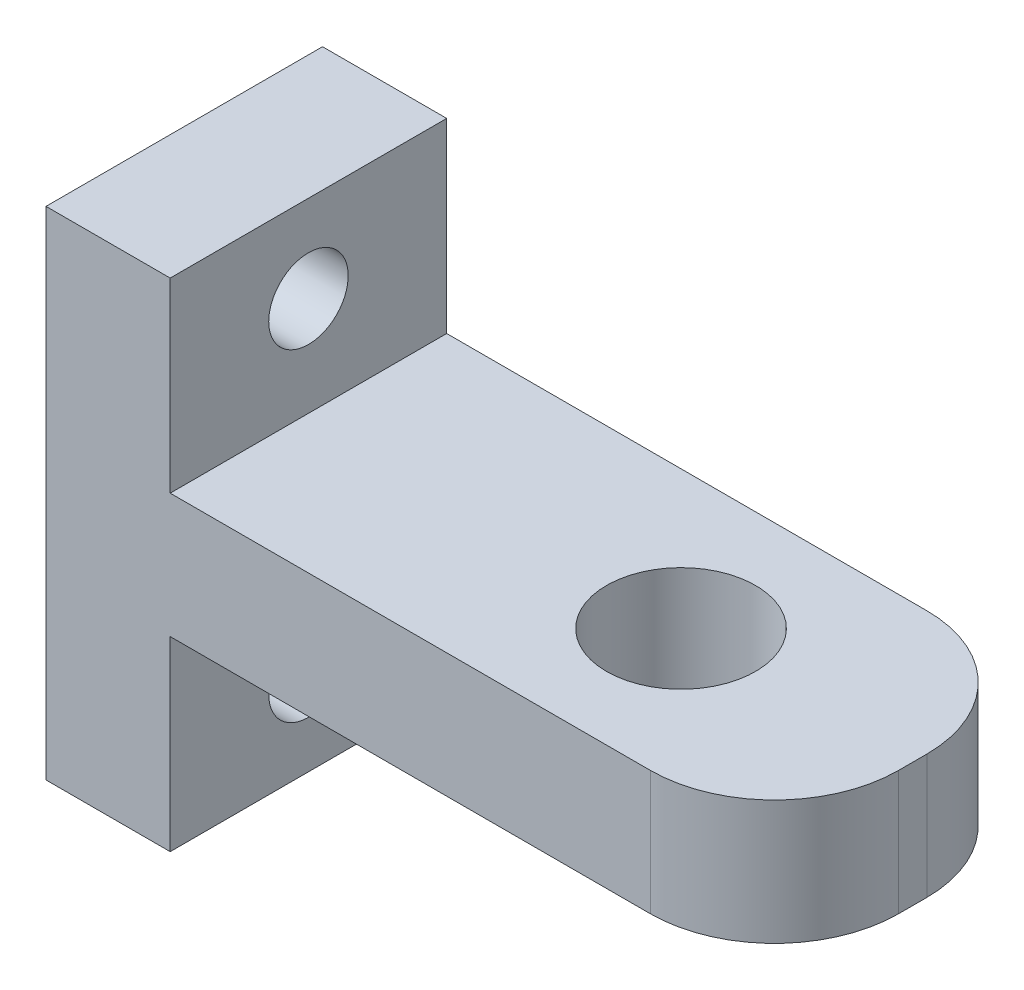
ISO-10303-21;
HEADER;
FILE_DESCRIPTION(('STEP AP214'),'2;1');
FILE_NAME('part.step','',(''),(''),'','','');
FILE_SCHEMA(('AUTOMOTIVE_DESIGN { 1 0 10303 214 1 1 1 1 }'));
ENDSEC;
DATA;
#1=APPLICATION_CONTEXT('core data for automotive mechanical design processes');
#2=APPLICATION_PROTOCOL_DEFINITION('international standard','automotive_design',2000,#1);
#3=PRODUCT_CONTEXT('',#1,'mechanical');
#4=PRODUCT('Part','Part','',(#3));
#5=PRODUCT_RELATED_PRODUCT_CATEGORY('part','',(#4));
#6=PRODUCT_DEFINITION_FORMATION('','',#4);
#7=PRODUCT_DEFINITION_CONTEXT('part definition',#1,'design');
#8=PRODUCT_DEFINITION('design','',#6,#7);
#9=PRODUCT_DEFINITION_SHAPE('','',#8);
#10=(LENGTH_UNIT() NAMED_UNIT(*) SI_UNIT(.MILLI.,.METRE.));
#11=(NAMED_UNIT(*) PLANE_ANGLE_UNIT() SI_UNIT($,.RADIAN.));
#12=(NAMED_UNIT(*) SI_UNIT($,.STERADIAN.) SOLID_ANGLE_UNIT());
#13=UNCERTAINTY_MEASURE_WITH_UNIT(LENGTH_MEASURE(1.E-05),#10,'distance_accuracy_value','');
#14=(GEOMETRIC_REPRESENTATION_CONTEXT(3) GLOBAL_UNCERTAINTY_ASSIGNED_CONTEXT((#13)) GLOBAL_UNIT_ASSIGNED_CONTEXT((#10,
#11,#12)) REPRESENTATION_CONTEXT('',''));
#15=CARTESIAN_POINT('',(0.,0.,0.));
#16=DIRECTION('',(0.,0.,1.));
#17=DIRECTION('',(1.,0.,0.));
#18=AXIS2_PLACEMENT_3D('',#15,#16,#17);
#19=CARTESIAN_POINT('',(0.,5.,0.));
#20=DIRECTION('',(0.,1.,0.));
#21=DIRECTION('',(0.,0.,1.));
#22=AXIS2_PLACEMENT_3D('',#19,#20,#21);
#23=PLANE('',#22);
#24=CARTESIAN_POINT('',(0.,5.,0.));
#25=DIRECTION('',(0.,1.,0.));
#26=DIRECTION('',(0.,0.,1.));
#27=AXIS2_PLACEMENT_3D('',#24,#25,#26);
#28=CIRCLE('',#27,3.);
#29=CARTESIAN_POINT('',(0.,5.,3.));
#30=VERTEX_POINT('',#29);
#31=EDGE_CURVE('E154',#30,#30,#28,.T.);
#32=ORIENTED_EDGE('',*,*,#31,.F.);
#33=EDGE_LOOP('',(#32));
#34=FACE_BOUND('',#33,.T.);
#35=DIRECTION('',(0.,0.,-1.));
#36=VECTOR('',#35,1.);
#37=CARTESIAN_POINT('',(9.32790403531548,5.,-5.56640777392));
#38=LINE('',#37,#36);
#39=CARTESIAN_POINT('',(9.32790403531548,5.,0.566407773919999));
#40=VERTEX_POINT('',#39);
#41=CARTESIAN_POINT('',(9.32790403531548,5.,-0.566407773919999));
#42=VERTEX_POINT('',#41);
#43=EDGE_CURVE('E144',#40,#42,#38,.T.);
#44=ORIENTED_EDGE('',*,*,#43,.T.);
#45=CARTESIAN_POINT('',(4.32790403531548,5.,-0.566407773919999));
#46=DIRECTION('',(0.,1.,0.));
#47=DIRECTION('',(0.,0.,1.));
#48=AXIS2_PLACEMENT_3D('',#45,#46,#47);
#49=CIRCLE('',#48,5.);
#50=CARTESIAN_POINT('',(4.32790403531548,5.,-5.56640777392));
#51=VERTEX_POINT('',#50);
#52=EDGE_CURVE('E179',#42,#51,#49,.T.);
#53=ORIENTED_EDGE('',*,*,#52,.T.);
#54=DIRECTION('',(-1.,0.,0.));
#55=VECTOR('',#54,1.);
#56=CARTESIAN_POINT('',(-15.,5.,-5.56640777392));
#57=LINE('',#56,#55);
#58=CARTESIAN_POINT('',(-15.,5.,-5.56640777392));
#59=VERTEX_POINT('',#58);
#60=EDGE_CURVE('E152',#51,#59,#57,.T.);
#61=ORIENTED_EDGE('',*,*,#60,.T.);
#62=DIRECTION('',(0.,0.,1.));
#63=VECTOR('',#62,1.);
#64=CARTESIAN_POINT('',(-15.,5.,-10.));
#65=LINE('',#64,#63);
#66=CARTESIAN_POINT('',(-15.,5.,5.56640777392));
#67=VERTEX_POINT('',#66);
#68=EDGE_CURVE('E158',#59,#67,#65,.T.);
#69=ORIENTED_EDGE('',*,*,#68,.T.);
#70=DIRECTION('',(1.,0.,0.));
#71=VECTOR('',#70,1.);
#72=CARTESIAN_POINT('',(-15.,5.,5.56640777392));
#73=LINE('',#72,#71);
#74=CARTESIAN_POINT('',(4.32790403531548,5.,5.56640777392));
#75=VERTEX_POINT('',#74);
#76=EDGE_CURVE('E141',#67,#75,#73,.T.);
#77=ORIENTED_EDGE('',*,*,#76,.T.);
#78=CARTESIAN_POINT('',(4.32790403531548,5.,0.566407773919999));
#79=DIRECTION('',(0.,1.,0.));
#80=DIRECTION('',(0.,0.,1.));
#81=AXIS2_PLACEMENT_3D('',#78,#79,#80);
#82=CIRCLE('',#81,5.);
#83=EDGE_CURVE('E177',#75,#40,#82,.T.);
#84=ORIENTED_EDGE('',*,*,#83,.T.);
#85=EDGE_LOOP('',(#44,#53,#61,#69,#77,#84));
#86=FACE_BOUND('',#85,.T.);
#87=ADVANCED_FACE('F36',(#34,#86),#23,.T.);
#88=CARTESIAN_POINT('',(0.,0.,0.));
#89=DIRECTION('',(0.,1.,0.));
#90=DIRECTION('',(0.,0.,1.));
#91=AXIS2_PLACEMENT_3D('',#88,#89,#90);
#92=PLANE('',#91);
#93=CARTESIAN_POINT('',(0.,0.,0.));
#94=DIRECTION('',(0.,1.,0.));
#95=DIRECTION('',(0.,0.,1.));
#96=AXIS2_PLACEMENT_3D('',#93,#94,#95);
#97=CIRCLE('',#96,3.);
#98=CARTESIAN_POINT('',(0.,0.,3.));
#99=VERTEX_POINT('',#98);
#100=EDGE_CURVE('E157',#99,#99,#97,.T.);
#101=ORIENTED_EDGE('',*,*,#100,.T.);
#102=EDGE_LOOP('',(#101));
#103=FACE_BOUND('',#102,.T.);
#104=DIRECTION('',(-1.,0.,0.));
#105=VECTOR('',#104,1.);
#106=CARTESIAN_POINT('',(0.,0.,-5.56640777392));
#107=LINE('',#106,#105);
#108=CARTESIAN_POINT('',(4.32790403531548,0.,-5.56640777392));
#109=VERTEX_POINT('',#108);
#110=CARTESIAN_POINT('',(-15.,0.,-5.56640777392));
#111=VERTEX_POINT('',#110);
#112=EDGE_CURVE('E170',#109,#111,#107,.T.);
#113=ORIENTED_EDGE('',*,*,#112,.F.);
#114=CARTESIAN_POINT('',(4.32790403531548,0.,-0.566407773919999));
#115=DIRECTION('',(0.,1.,0.));
#116=DIRECTION('',(0.,0.,1.));
#117=AXIS2_PLACEMENT_3D('',#114,#115,#116);
#118=CIRCLE('',#117,5.);
#119=CARTESIAN_POINT('',(9.32790403531548,0.,-0.566407773919999));
#120=VERTEX_POINT('',#119);
#121=EDGE_CURVE('E44',#109,#120,#118,.F.);
#122=ORIENTED_EDGE('',*,*,#121,.T.);
#123=DIRECTION('',(0.,0.,-1.));
#124=VECTOR('',#123,1.);
#125=CARTESIAN_POINT('',(9.32790403531548,0.,0.));
#126=LINE('',#125,#124);
#127=CARTESIAN_POINT('',(9.32790403531548,0.,0.566407773919999));
#128=VERTEX_POINT('',#127);
#129=EDGE_CURVE('E167',#128,#120,#126,.T.);
#130=ORIENTED_EDGE('',*,*,#129,.F.);
#131=CARTESIAN_POINT('',(4.32790403531548,0.,0.566407773919999));
#132=DIRECTION('',(0.,1.,0.));
#133=DIRECTION('',(0.,0.,1.));
#134=AXIS2_PLACEMENT_3D('',#131,#132,#133);
#135=CIRCLE('',#134,5.);
#136=CARTESIAN_POINT('',(4.32790403531548,0.,5.56640777392));
#137=VERTEX_POINT('',#136);
#138=EDGE_CURVE('E51',#128,#137,#135,.F.);
#139=ORIENTED_EDGE('',*,*,#138,.T.);
#140=DIRECTION('',(1.,0.,0.));
#141=VECTOR('',#140,1.);
#142=CARTESIAN_POINT('',(0.,0.,5.56640777392));
#143=LINE('',#142,#141);
#144=CARTESIAN_POINT('',(-15.,0.,5.56640777392));
#145=VERTEX_POINT('',#144);
#146=EDGE_CURVE('E161',#145,#137,#143,.T.);
#147=ORIENTED_EDGE('',*,*,#146,.F.);
#148=DIRECTION('',(0.,0.,1.));
#149=VECTOR('',#148,1.);
#150=CARTESIAN_POINT('',(-15.,0.,-10.));
#151=LINE('',#150,#149);
#152=EDGE_CURVE('E162',#111,#145,#151,.T.);
#153=ORIENTED_EDGE('',*,*,#152,.F.);
#154=EDGE_LOOP('',(#113,#122,#130,#139,#147,#153));
#155=FACE_BOUND('',#154,.T.);
#156=ADVANCED_FACE('F183',(#103,#155),#92,.F.);
#157=CARTESIAN_POINT('',(0.,-5.,0.));
#158=DIRECTION('',(0.,1.,0.));
#159=DIRECTION('',(0.,0.,1.));
#160=AXIS2_PLACEMENT_3D('',#157,#158,#159);
#161=CYLINDRICAL_SURFACE('',#160,3.);
#162=ORIENTED_EDGE('',*,*,#31,.T.);
#163=EDGE_LOOP('',(#162));
#164=FACE_BOUND('',#163,.T.);
#165=ORIENTED_EDGE('',*,*,#100,.F.);
#166=EDGE_LOOP('',(#165));
#167=FACE_BOUND('',#166,.T.);
#168=ADVANCED_FACE('F263',(#164,#167),#161,.F.);
#169=CARTESIAN_POINT('',(-15.,-5.,-5.56640777392));
#170=DIRECTION('',(0.,0.,-1.));
#171=DIRECTION('',(-1.,0.,0.));
#172=AXIS2_PLACEMENT_3D('',#169,#170,#171);
#173=PLANE('',#172);
#174=ORIENTED_EDGE('',*,*,#60,.F.);
#175=DIRECTION('',(0.,1.,0.));
#176=VECTOR('',#175,1.);
#177=CARTESIAN_POINT('',(4.32790403531548,-5.,-5.56640777392));
#178=LINE('',#177,#176);
#179=EDGE_CURVE('E59',#51,#109,#178,.F.);
#180=ORIENTED_EDGE('',*,*,#179,.T.);
#181=ORIENTED_EDGE('',*,*,#112,.T.);
#182=DIRECTION('',(0.,-1.,0.));
#183=VECTOR('',#182,1.);
#184=CARTESIAN_POINT('',(-15.,-7.5,-5.56640777392));
#185=LINE('',#184,#183);
#186=CARTESIAN_POINT('',(-15.,-7.5,-5.56640777392));
#187=VERTEX_POINT('',#186);
#188=EDGE_CURVE('E199',#111,#187,#185,.T.);
#189=ORIENTED_EDGE('',*,*,#188,.T.);
#190=DIRECTION('',(1.,0.,0.));
#191=VECTOR('',#190,1.);
#192=CARTESIAN_POINT('',(-20.,-7.5,-5.56640777392));
#193=LINE('',#192,#191);
#194=CARTESIAN_POINT('',(-20.,-7.5,-5.56640777392));
#195=VERTEX_POINT('',#194);
#196=EDGE_CURVE('E146',#195,#187,#193,.T.);
#197=ORIENTED_EDGE('',*,*,#196,.F.);
#198=DIRECTION('',(0.,-1.,0.));
#199=VECTOR('',#198,1.);
#200=CARTESIAN_POINT('',(-20.,-7.5,-5.56640777392));
#201=LINE('',#200,#199);
#202=CARTESIAN_POINT('',(-20.,12.5,-5.56640777392));
#203=VERTEX_POINT('',#202);
#204=EDGE_CURVE('E125',#203,#195,#201,.T.);
#205=ORIENTED_EDGE('',*,*,#204,.F.);
#206=DIRECTION('',(1.,0.,0.));
#207=VECTOR('',#206,1.);
#208=CARTESIAN_POINT('',(-20.,12.5,-5.56640777392));
#209=LINE('',#208,#207);
#210=CARTESIAN_POINT('',(-15.,12.5,-5.56640777392));
#211=VERTEX_POINT('',#210);
#212=EDGE_CURVE('E122',#203,#211,#209,.T.);
#213=ORIENTED_EDGE('',*,*,#212,.T.);
#214=EDGE_CURVE('E197',#211,#59,#185,.T.);
#215=ORIENTED_EDGE('',*,*,#214,.T.);
#216=EDGE_LOOP('',(#174,#180,#181,#189,#197,#205,#213,#215));
#217=FACE_BOUND('',#216,.T.);
#218=ADVANCED_FACE('F195',(#217),#173,.T.);
#219=CARTESIAN_POINT('',(9.32790403531548,-5.,-5.56640777392));
#220=DIRECTION('',(1.,0.,0.));
#221=DIRECTION('',(0.,0.,-1.));
#222=AXIS2_PLACEMENT_3D('',#219,#220,#221);
#223=PLANE('',#222);
#224=ORIENTED_EDGE('',*,*,#129,.T.);
#225=DIRECTION('',(0.,1.,0.));
#226=VECTOR('',#225,1.);
#227=CARTESIAN_POINT('',(9.32790403531548,-5.,-0.566407773919999));
#228=LINE('',#227,#226);
#229=EDGE_CURVE('E174',#120,#42,#228,.T.);
#230=ORIENTED_EDGE('',*,*,#229,.T.);
#231=ORIENTED_EDGE('',*,*,#43,.F.);
#232=DIRECTION('',(0.,1.,0.));
#233=VECTOR('',#232,1.);
#234=CARTESIAN_POINT('',(9.32790403531548,-5.,0.566407773919999));
#235=LINE('',#234,#233);
#236=EDGE_CURVE('E172',#40,#128,#235,.F.);
#237=ORIENTED_EDGE('',*,*,#236,.T.);
#238=EDGE_LOOP('',(#224,#230,#231,#237));
#239=FACE_BOUND('',#238,.T.);
#240=ADVANCED_FACE('F188',(#239),#223,.T.);
#241=CARTESIAN_POINT('',(-15.,-5.,5.56640777392));
#242=DIRECTION('',(0.,0.,1.));
#243=DIRECTION('',(1.,0.,0.));
#244=AXIS2_PLACEMENT_3D('',#241,#242,#243);
#245=PLANE('',#244);
#246=ORIENTED_EDGE('',*,*,#146,.T.);
#247=DIRECTION('',(0.,1.,0.));
#248=VECTOR('',#247,1.);
#249=CARTESIAN_POINT('',(4.32790403531548,-5.,5.56640777392));
#250=LINE('',#249,#248);
#251=EDGE_CURVE('E12',#137,#75,#250,.T.);
#252=ORIENTED_EDGE('',*,*,#251,.T.);
#253=ORIENTED_EDGE('',*,*,#76,.F.);
#254=DIRECTION('',(0.,1.,0.));
#255=VECTOR('',#254,1.);
#256=CARTESIAN_POINT('',(-15.,-7.5,5.56640777392));
#257=LINE('',#256,#255);
#258=CARTESIAN_POINT('',(-15.,12.5,5.56640777392));
#259=VERTEX_POINT('',#258);
#260=EDGE_CURVE('E139',#67,#259,#257,.T.);
#261=ORIENTED_EDGE('',*,*,#260,.T.);
#262=DIRECTION('',(1.,0.,0.));
#263=VECTOR('',#262,1.);
#264=CARTESIAN_POINT('',(-20.,12.5,5.56640777392));
#265=LINE('',#264,#263);
#266=CARTESIAN_POINT('',(-20.,12.5,5.56640777392));
#267=VERTEX_POINT('',#266);
#268=EDGE_CURVE('E120',#267,#259,#265,.T.);
#269=ORIENTED_EDGE('',*,*,#268,.F.);
#270=DIRECTION('',(0.,1.,0.));
#271=VECTOR('',#270,1.);
#272=CARTESIAN_POINT('',(-20.,-7.5,5.56640777392));
#273=LINE('',#272,#271);
#274=CARTESIAN_POINT('',(-20.,-7.5,5.56640777392));
#275=VERTEX_POINT('',#274);
#276=EDGE_CURVE('E126',#275,#267,#273,.T.);
#277=ORIENTED_EDGE('',*,*,#276,.F.);
#278=DIRECTION('',(1.,0.,0.));
#279=VECTOR('',#278,1.);
#280=CARTESIAN_POINT('',(-20.,-7.5,5.56640777392));
#281=LINE('',#280,#279);
#282=CARTESIAN_POINT('',(-15.,-7.5,5.56640777392));
#283=VERTEX_POINT('',#282);
#284=EDGE_CURVE('E206',#275,#283,#281,.T.);
#285=ORIENTED_EDGE('',*,*,#284,.T.);
#286=EDGE_CURVE('E217',#283,#145,#257,.T.);
#287=ORIENTED_EDGE('',*,*,#286,.T.);
#288=EDGE_LOOP('',(#246,#252,#253,#261,#269,#277,#285,#287));
#289=FACE_BOUND('',#288,.T.);
#290=ADVANCED_FACE('F137',(#289),#245,.T.);
#291=CARTESIAN_POINT('',(-15.,0.,0.));
#292=DIRECTION('',(1.,0.,0.));
#293=DIRECTION('',(0.,0.,-1.));
#294=AXIS2_PLACEMENT_3D('',#291,#292,#293);
#295=PLANE('',#294);
#296=CARTESIAN_POINT('',(-15.,9.,0.));
#297=DIRECTION('',(-1.,0.,0.));
#298=DIRECTION('',(0.,0.,1.));
#299=AXIS2_PLACEMENT_3D('',#296,#297,#298);
#300=CIRCLE('',#299,1.6);
#301=CARTESIAN_POINT('',(-15.,9.,1.6));
#302=VERTEX_POINT('',#301);
#303=EDGE_CURVE('E218',#302,#302,#300,.T.);
#304=ORIENTED_EDGE('',*,*,#303,.T.);
#305=EDGE_LOOP('',(#304));
#306=FACE_BOUND('',#305,.T.);
#307=ORIENTED_EDGE('',*,*,#68,.F.);
#308=ORIENTED_EDGE('',*,*,#214,.F.);
#309=DIRECTION('',(0.,0.,-1.));
#310=VECTOR('',#309,1.);
#311=CARTESIAN_POINT('',(-15.,12.5,-5.56640777392));
#312=LINE('',#311,#310);
#313=EDGE_CURVE('E202',#259,#211,#312,.T.);
#314=ORIENTED_EDGE('',*,*,#313,.F.);
#315=ORIENTED_EDGE('',*,*,#260,.F.);
#316=EDGE_LOOP('',(#307,#308,#314,#315));
#317=FACE_BOUND('',#316,.T.);
#318=ADVANCED_FACE('F234',(#306,#317),#295,.T.);
#319=CARTESIAN_POINT('',(-20.,12.5,-5.56640777392));
#320=DIRECTION('',(0.,-1.,0.));
#321=DIRECTION('',(0.,0.,-1.));
#322=AXIS2_PLACEMENT_3D('',#319,#320,#321);
#323=PLANE('',#322);
#324=ORIENTED_EDGE('',*,*,#313,.T.);
#325=ORIENTED_EDGE('',*,*,#212,.F.);
#326=DIRECTION('',(0.,0.,-1.));
#327=VECTOR('',#326,1.);
#328=CARTESIAN_POINT('',(-20.,12.5,-5.56640777392));
#329=LINE('',#328,#327);
#330=EDGE_CURVE('E116',#267,#203,#329,.T.);
#331=ORIENTED_EDGE('',*,*,#330,.F.);
#332=ORIENTED_EDGE('',*,*,#268,.T.);
#333=EDGE_LOOP('',(#324,#325,#331,#332));
#334=FACE_BOUND('',#333,.T.);
#335=ADVANCED_FACE('F118',(#334),#323,.F.);
#336=CARTESIAN_POINT('',(-20.,-7.5,-5.56640777392));
#337=DIRECTION('',(0.,1.,0.));
#338=DIRECTION('',(0.,0.,1.));
#339=AXIS2_PLACEMENT_3D('',#336,#337,#338);
#340=PLANE('',#339);
#341=DIRECTION('',(0.,0.,1.));
#342=VECTOR('',#341,1.);
#343=CARTESIAN_POINT('',(-15.,-7.5,-5.56640777392));
#344=LINE('',#343,#342);
#345=EDGE_CURVE('E135',#187,#283,#344,.T.);
#346=ORIENTED_EDGE('',*,*,#345,.T.);
#347=ORIENTED_EDGE('',*,*,#284,.F.);
#348=DIRECTION('',(0.,0.,1.));
#349=VECTOR('',#348,1.);
#350=CARTESIAN_POINT('',(-20.,-7.5,-5.56640777392));
#351=LINE('',#350,#349);
#352=EDGE_CURVE('E131',#195,#275,#351,.T.);
#353=ORIENTED_EDGE('',*,*,#352,.F.);
#354=ORIENTED_EDGE('',*,*,#196,.T.);
#355=EDGE_LOOP('',(#346,#347,#353,#354));
#356=FACE_BOUND('',#355,.T.);
#357=ADVANCED_FACE('F211',(#356),#340,.F.);
#358=CARTESIAN_POINT('',(-20.,0.,0.));
#359=DIRECTION('',(1.,0.,0.));
#360=DIRECTION('',(0.,0.,-1.));
#361=AXIS2_PLACEMENT_3D('',#358,#359,#360);
#362=PLANE('',#361);
#363=CARTESIAN_POINT('',(-20.,9.,0.));
#364=DIRECTION('',(-1.,0.,0.));
#365=DIRECTION('',(0.,0.,1.));
#366=AXIS2_PLACEMENT_3D('',#363,#364,#365);
#367=CIRCLE('',#366,1.6);
#368=CARTESIAN_POINT('',(-20.,9.,1.59999999999999));
#369=VERTEX_POINT('',#368);
#370=EDGE_CURVE('E228',#369,#369,#367,.T.);
#371=ORIENTED_EDGE('',*,*,#370,.F.);
#372=EDGE_LOOP('',(#371));
#373=FACE_BOUND('',#372,.T.);
#374=CARTESIAN_POINT('',(-20.,-3.99999999999999,0.));
#375=DIRECTION('',(-1.,0.,0.));
#376=DIRECTION('',(0.,0.,-1.));
#377=AXIS2_PLACEMENT_3D('',#374,#375,#376);
#378=CIRCLE('',#377,1.6);
#379=CARTESIAN_POINT('',(-20.,-3.99999999999999,-1.60000000000001));
#380=VERTEX_POINT('',#379);
#381=EDGE_CURVE('E222',#380,#380,#378,.T.);
#382=ORIENTED_EDGE('',*,*,#381,.F.);
#383=EDGE_LOOP('',(#382));
#384=FACE_BOUND('',#383,.T.);
#385=ORIENTED_EDGE('',*,*,#276,.T.);
#386=ORIENTED_EDGE('',*,*,#330,.T.);
#387=ORIENTED_EDGE('',*,*,#204,.T.);
#388=ORIENTED_EDGE('',*,*,#352,.T.);
#389=EDGE_LOOP('',(#385,#386,#387,#388));
#390=FACE_BOUND('',#389,.T.);
#391=ADVANCED_FACE('F129',(#373,#384,#390),#362,.F.);
#392=CARTESIAN_POINT('',(-15.,-3.99999999999999,0.));
#393=DIRECTION('',(-1.,0.,0.));
#394=DIRECTION('',(0.,0.,-1.));
#395=AXIS2_PLACEMENT_3D('',#392,#393,#394);
#396=CIRCLE('',#395,1.6);
#397=CARTESIAN_POINT('',(-15.,-3.99999999999999,-1.6));
#398=VERTEX_POINT('',#397);
#399=EDGE_CURVE('E225',#398,#398,#396,.T.);
#400=ORIENTED_EDGE('',*,*,#399,.T.);
#401=EDGE_LOOP('',(#400));
#402=FACE_BOUND('',#401,.T.);
#403=ORIENTED_EDGE('',*,*,#188,.F.);
#404=ORIENTED_EDGE('',*,*,#152,.T.);
#405=ORIENTED_EDGE('',*,*,#286,.F.);
#406=ORIENTED_EDGE('',*,*,#345,.F.);
#407=EDGE_LOOP('',(#403,#404,#405,#406));
#408=FACE_BOUND('',#407,.T.);
#409=ADVANCED_FACE('F215',(#402,#408),#295,.T.);
#410=CARTESIAN_POINT('',(-15.,-3.99999999999999,0.));
#411=DIRECTION('',(-1.,0.,0.));
#412=DIRECTION('',(0.,0.,1.));
#413=AXIS2_PLACEMENT_3D('',#410,#411,#412);
#414=CYLINDRICAL_SURFACE('',#413,1.6);
#415=ORIENTED_EDGE('',*,*,#399,.F.);
#416=EDGE_LOOP('',(#415));
#417=FACE_BOUND('',#416,.T.);
#418=ORIENTED_EDGE('',*,*,#381,.T.);
#419=EDGE_LOOP('',(#418));
#420=FACE_BOUND('',#419,.T.);
#421=ADVANCED_FACE('F239',(#417,#420),#414,.F.);
#422=CARTESIAN_POINT('',(-15.,9.,0.));
#423=DIRECTION('',(-1.,0.,0.));
#424=DIRECTION('',(0.,0.,1.));
#425=AXIS2_PLACEMENT_3D('',#422,#423,#424);
#426=CYLINDRICAL_SURFACE('',#425,1.6);
#427=ORIENTED_EDGE('',*,*,#303,.F.);
#428=EDGE_LOOP('',(#427));
#429=FACE_BOUND('',#428,.T.);
#430=ORIENTED_EDGE('',*,*,#370,.T.);
#431=EDGE_LOOP('',(#430));
#432=FACE_BOUND('',#431,.T.);
#433=ADVANCED_FACE('F236',(#429,#432),#426,.F.);
#434=CARTESIAN_POINT('',(4.32790403531548,-5.,-0.566407773919999));
#435=DIRECTION('',(0.,1.,0.));
#436=DIRECTION('',(0.,0.,1.));
#437=AXIS2_PLACEMENT_3D('',#434,#435,#436);
#438=CYLINDRICAL_SURFACE('',#437,5.);
#439=ORIENTED_EDGE('',*,*,#121,.F.);
#440=ORIENTED_EDGE('',*,*,#179,.F.);
#441=ORIENTED_EDGE('',*,*,#52,.F.);
#442=ORIENTED_EDGE('',*,*,#229,.F.);
#443=EDGE_LOOP('',(#439,#440,#441,#442));
#444=FACE_BOUND('',#443,.T.);
#445=ADVANCED_FACE('F191',(#444),#438,.T.);
#446=CARTESIAN_POINT('',(4.32790403531548,-5.,0.566407773919999));
#447=DIRECTION('',(0.,1.,0.));
#448=DIRECTION('',(0.,0.,1.));
#449=AXIS2_PLACEMENT_3D('',#446,#447,#448);
#450=CYLINDRICAL_SURFACE('',#449,5.);
#451=ORIENTED_EDGE('',*,*,#138,.F.);
#452=ORIENTED_EDGE('',*,*,#236,.F.);
#453=ORIENTED_EDGE('',*,*,#83,.F.);
#454=ORIENTED_EDGE('',*,*,#251,.F.);
#455=EDGE_LOOP('',(#451,#452,#453,#454));
#456=FACE_BOUND('',#455,.T.);
#457=ADVANCED_FACE('F38',(#456),#450,.T.);
#458=CLOSED_SHELL('',(#87,#156,#168,#218,#240,#290,#318,#335,#357,#391,#409,#421,#433,#445,#457));
#459=MANIFOLD_SOLID_BREP('B2',#458);
#460=ADVANCED_BREP_SHAPE_REPRESENTATION('',(#18,#459),#14);
#461=SHAPE_DEFINITION_REPRESENTATION(#9,#460);
ENDSEC;
END-ISO-10303-21;
